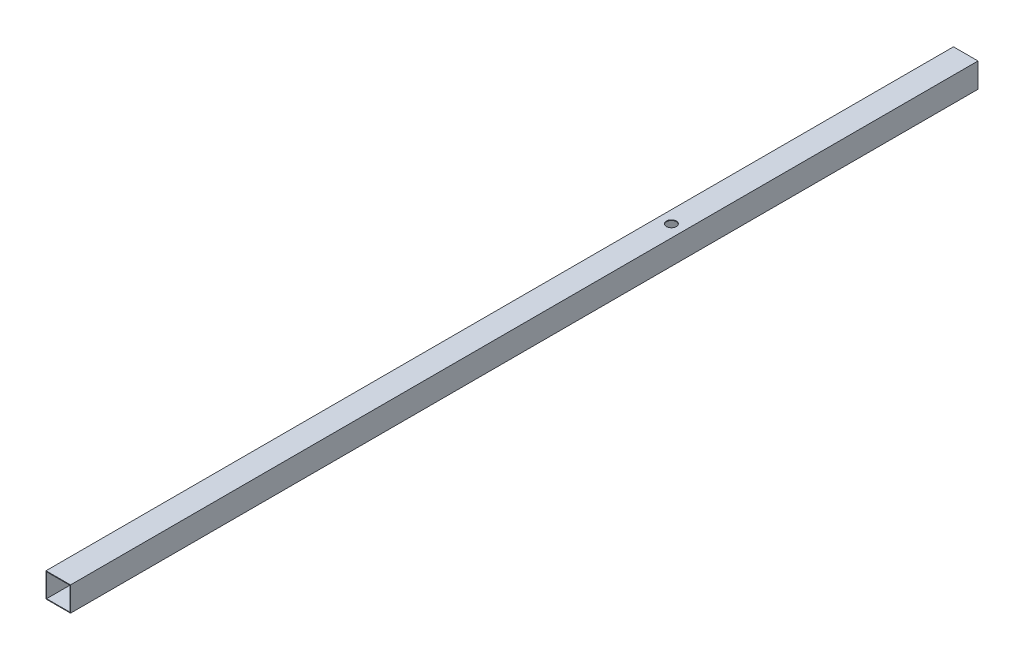
ISO-10303-21;
HEADER;
FILE_DESCRIPTION(('STEP AP214'),'2;1');
FILE_NAME('part.step','',(''),(''),'','','');
FILE_SCHEMA(('AUTOMOTIVE_DESIGN { 1 0 10303 214 1 1 1 1 }'));
ENDSEC;
DATA;
#1=APPLICATION_CONTEXT('core data for automotive mechanical design processes');
#2=APPLICATION_PROTOCOL_DEFINITION('international standard','automotive_design',2000,#1);
#3=PRODUCT_CONTEXT('',#1,'mechanical');
#4=PRODUCT('Part','Part','',(#3));
#5=PRODUCT_RELATED_PRODUCT_CATEGORY('part','',(#4));
#6=PRODUCT_DEFINITION_FORMATION('','',#4);
#7=PRODUCT_DEFINITION_CONTEXT('part definition',#1,'design');
#8=PRODUCT_DEFINITION('design','',#6,#7);
#9=PRODUCT_DEFINITION_SHAPE('','',#8);
#10=(LENGTH_UNIT() NAMED_UNIT(*) SI_UNIT(.MILLI.,.METRE.));
#11=(NAMED_UNIT(*) PLANE_ANGLE_UNIT() SI_UNIT($,.RADIAN.));
#12=(NAMED_UNIT(*) SI_UNIT($,.STERADIAN.) SOLID_ANGLE_UNIT());
#13=UNCERTAINTY_MEASURE_WITH_UNIT(LENGTH_MEASURE(1.E-05),#10,'distance_accuracy_value','');
#14=(GEOMETRIC_REPRESENTATION_CONTEXT(3) GLOBAL_UNCERTAINTY_ASSIGNED_CONTEXT((#13)) GLOBAL_UNIT_ASSIGNED_CONTEXT((#10,
#11,#12)) REPRESENTATION_CONTEXT('',''));
#15=CARTESIAN_POINT('',(0.,0.,0.));
#16=DIRECTION('',(0.,0.,1.));
#17=DIRECTION('',(1.,0.,0.));
#18=AXIS2_PLACEMENT_3D('',#15,#16,#17);
#19=CARTESIAN_POINT('',(10.,10.,740.));
#20=DIRECTION('',(-1.,0.,0.));
#21=DIRECTION('',(0.,-1.,0.));
#22=AXIS2_PLACEMENT_3D('',#19,#20,#21);
#23=PLANE('',#22);
#24=DIRECTION('',(0.,1.,0.));
#25=VECTOR('',#24,1.);
#26=CARTESIAN_POINT('',(10.,10.,0.));
#27=LINE('',#26,#25);
#28=CARTESIAN_POINT('',(10.,-10.,0.));
#29=VERTEX_POINT('',#28);
#30=CARTESIAN_POINT('',(10.,10.,0.));
#31=VERTEX_POINT('',#30);
#32=EDGE_CURVE('E134',#29,#31,#27,.T.);
#33=ORIENTED_EDGE('',*,*,#32,.T.);
#34=DIRECTION('',(0.,0.,-1.));
#35=VECTOR('',#34,1.);
#36=CARTESIAN_POINT('',(10.,10.,740.));
#37=LINE('',#36,#35);
#38=CARTESIAN_POINT('',(10.,10.,740.));
#39=VERTEX_POINT('',#38);
#40=EDGE_CURVE('E11',#39,#31,#37,.T.);
#41=ORIENTED_EDGE('',*,*,#40,.F.);
#42=DIRECTION('',(0.,1.,0.));
#43=VECTOR('',#42,1.);
#44=CARTESIAN_POINT('',(10.,10.,740.));
#45=LINE('',#44,#43);
#46=CARTESIAN_POINT('',(10.,-10.,740.));
#47=VERTEX_POINT('',#46);
#48=EDGE_CURVE('E138',#47,#39,#45,.T.);
#49=ORIENTED_EDGE('',*,*,#48,.F.);
#50=DIRECTION('',(0.,0.,-1.));
#51=VECTOR('',#50,1.);
#52=CARTESIAN_POINT('',(10.,-10.,740.));
#53=LINE('',#52,#51);
#54=EDGE_CURVE('E148',#47,#29,#53,.T.);
#55=ORIENTED_EDGE('',*,*,#54,.T.);
#56=EDGE_LOOP('',(#33,#41,#49,#55));
#57=FACE_BOUND('',#56,.T.);
#58=ADVANCED_FACE('F33',(#57),#23,.F.);
#59=CARTESIAN_POINT('',(-10.,10.,740.));
#60=DIRECTION('',(0.,-1.,0.));
#61=DIRECTION('',(0.,0.,-1.));
#62=AXIS2_PLACEMENT_3D('',#59,#60,#61);
#63=PLANE('',#62);
#64=CARTESIAN_POINT('',(0.,10.,240.));
#65=DIRECTION('',(0.,-1.,0.));
#66=DIRECTION('',(0.,0.,-1.));
#67=AXIS2_PLACEMENT_3D('',#64,#65,#66);
#68=CIRCLE('',#67,4.00000000000001);
#69=CARTESIAN_POINT('',(0.,10.,236.));
#70=VERTEX_POINT('',#69);
#71=EDGE_CURVE('E226',#70,#70,#68,.T.);
#72=ORIENTED_EDGE('',*,*,#71,.T.);
#73=EDGE_LOOP('',(#72));
#74=FACE_BOUND('',#73,.T.);
#75=DIRECTION('',(-1.,0.,0.));
#76=VECTOR('',#75,1.);
#77=CARTESIAN_POINT('',(-10.,10.,0.));
#78=LINE('',#77,#76);
#79=CARTESIAN_POINT('',(-10.,10.,0.));
#80=VERTEX_POINT('',#79);
#81=EDGE_CURVE('E151',#31,#80,#78,.T.);
#82=ORIENTED_EDGE('',*,*,#81,.T.);
#83=DIRECTION('',(0.,0.,-1.));
#84=VECTOR('',#83,1.);
#85=CARTESIAN_POINT('',(-10.,10.,740.));
#86=LINE('',#85,#84);
#87=CARTESIAN_POINT('',(-10.,10.,740.));
#88=VERTEX_POINT('',#87);
#89=EDGE_CURVE('E41',#88,#80,#86,.T.);
#90=ORIENTED_EDGE('',*,*,#89,.F.);
#91=DIRECTION('',(-1.,0.,0.));
#92=VECTOR('',#91,1.);
#93=CARTESIAN_POINT('',(-10.,10.,740.));
#94=LINE('',#93,#92);
#95=EDGE_CURVE('E141',#39,#88,#94,.T.);
#96=ORIENTED_EDGE('',*,*,#95,.F.);
#97=ORIENTED_EDGE('',*,*,#40,.T.);
#98=EDGE_LOOP('',(#82,#90,#96,#97));
#99=FACE_BOUND('',#98,.T.);
#100=ADVANCED_FACE('F180',(#74,#99),#63,.F.);
#101=CARTESIAN_POINT('',(-10.,10.,740.));
#102=DIRECTION('',(1.,0.,0.));
#103=DIRECTION('',(0.,1.,0.));
#104=AXIS2_PLACEMENT_3D('',#101,#102,#103);
#105=PLANE('',#104);
#106=DIRECTION('',(0.,-1.,0.));
#107=VECTOR('',#106,1.);
#108=CARTESIAN_POINT('',(-10.,10.,0.));
#109=LINE('',#108,#107);
#110=CARTESIAN_POINT('',(-10.,-10.,0.));
#111=VERTEX_POINT('',#110);
#112=EDGE_CURVE('E153',#80,#111,#109,.T.);
#113=ORIENTED_EDGE('',*,*,#112,.T.);
#114=DIRECTION('',(0.,0.,-1.));
#115=VECTOR('',#114,1.);
#116=CARTESIAN_POINT('',(-10.,-10.,740.));
#117=LINE('',#116,#115);
#118=CARTESIAN_POINT('',(-10.,-10.,740.));
#119=VERTEX_POINT('',#118);
#120=EDGE_CURVE('E158',#119,#111,#117,.T.);
#121=ORIENTED_EDGE('',*,*,#120,.F.);
#122=DIRECTION('',(0.,-1.,0.));
#123=VECTOR('',#122,1.);
#124=CARTESIAN_POINT('',(-10.,10.,740.));
#125=LINE('',#124,#123);
#126=EDGE_CURVE('E144',#88,#119,#125,.T.);
#127=ORIENTED_EDGE('',*,*,#126,.F.);
#128=ORIENTED_EDGE('',*,*,#89,.T.);
#129=EDGE_LOOP('',(#113,#121,#127,#128));
#130=FACE_BOUND('',#129,.T.);
#131=ADVANCED_FACE('F166',(#130),#105,.F.);
#132=CARTESIAN_POINT('',(-10.,-10.,740.));
#133=DIRECTION('',(0.,1.,0.));
#134=DIRECTION('',(0.,0.,1.));
#135=AXIS2_PLACEMENT_3D('',#132,#133,#134);
#136=PLANE('',#135);
#137=CARTESIAN_POINT('',(0.,-10.,240.));
#138=DIRECTION('',(0.,-1.,0.));
#139=DIRECTION('',(0.,0.,-1.));
#140=AXIS2_PLACEMENT_3D('',#137,#138,#139);
#141=CIRCLE('',#140,4.00000000000001);
#142=CARTESIAN_POINT('',(0.,-10.,236.));
#143=VERTEX_POINT('',#142);
#144=EDGE_CURVE('E222',#143,#143,#141,.T.);
#145=ORIENTED_EDGE('',*,*,#144,.F.);
#146=EDGE_LOOP('',(#145));
#147=FACE_BOUND('',#146,.T.);
#148=DIRECTION('',(1.,0.,0.));
#149=VECTOR('',#148,1.);
#150=CARTESIAN_POINT('',(-10.,-10.,0.));
#151=LINE('',#150,#149);
#152=EDGE_CURVE('E142',#111,#29,#151,.T.);
#153=ORIENTED_EDGE('',*,*,#152,.T.);
#154=ORIENTED_EDGE('',*,*,#54,.F.);
#155=DIRECTION('',(1.,0.,0.));
#156=VECTOR('',#155,1.);
#157=CARTESIAN_POINT('',(-10.,-10.,740.));
#158=LINE('',#157,#156);
#159=EDGE_CURVE('E146',#119,#47,#158,.T.);
#160=ORIENTED_EDGE('',*,*,#159,.F.);
#161=ORIENTED_EDGE('',*,*,#120,.T.);
#162=EDGE_LOOP('',(#153,#154,#160,#161));
#163=FACE_BOUND('',#162,.T.);
#164=ADVANCED_FACE('F175',(#147,#163),#136,.F.);
#165=CARTESIAN_POINT('',(0.,0.,740.));
#166=DIRECTION('',(0.,0.,1.));
#167=DIRECTION('',(1.,0.,0.));
#168=AXIS2_PLACEMENT_3D('',#165,#166,#167);
#169=PLANE('',#168);
#170=DIRECTION('',(0.,1.,0.));
#171=VECTOR('',#170,1.);
#172=CARTESIAN_POINT('',(-9.5,9.5,740.));
#173=LINE('',#172,#171);
#174=CARTESIAN_POINT('',(-9.5,-9.5,740.));
#175=VERTEX_POINT('',#174);
#176=CARTESIAN_POINT('',(-9.5,9.5,740.));
#177=VERTEX_POINT('',#176);
#178=EDGE_CURVE('E100',#175,#177,#173,.T.);
#179=ORIENTED_EDGE('',*,*,#178,.T.);
#180=DIRECTION('',(1.,0.,0.));
#181=VECTOR('',#180,1.);
#182=CARTESIAN_POINT('',(9.5,9.5,740.));
#183=LINE('',#182,#181);
#184=CARTESIAN_POINT('',(9.5,9.5,740.));
#185=VERTEX_POINT('',#184);
#186=EDGE_CURVE('E109',#177,#185,#183,.T.);
#187=ORIENTED_EDGE('',*,*,#186,.T.);
#188=DIRECTION('',(0.,-1.,0.));
#189=VECTOR('',#188,1.);
#190=CARTESIAN_POINT('',(9.5,9.5,740.));
#191=LINE('',#190,#189);
#192=CARTESIAN_POINT('',(9.5,-9.5,740.));
#193=VERTEX_POINT('',#192);
#194=EDGE_CURVE('E48',#185,#193,#191,.T.);
#195=ORIENTED_EDGE('',*,*,#194,.T.);
#196=DIRECTION('',(-1.,0.,0.));
#197=VECTOR('',#196,1.);
#198=CARTESIAN_POINT('',(9.5,-9.5,740.));
#199=LINE('',#198,#197);
#200=EDGE_CURVE('E106',#193,#175,#199,.T.);
#201=ORIENTED_EDGE('',*,*,#200,.T.);
#202=EDGE_LOOP('',(#179,#187,#195,#201));
#203=FACE_BOUND('',#202,.T.);
#204=ORIENTED_EDGE('',*,*,#48,.T.);
#205=ORIENTED_EDGE('',*,*,#95,.T.);
#206=ORIENTED_EDGE('',*,*,#126,.T.);
#207=ORIENTED_EDGE('',*,*,#159,.T.);
#208=EDGE_LOOP('',(#204,#205,#206,#207));
#209=FACE_BOUND('',#208,.T.);
#210=ADVANCED_FACE('F113',(#203,#209),#169,.T.);
#211=CARTESIAN_POINT('',(0.,0.,0.));
#212=DIRECTION('',(0.,0.,1.));
#213=DIRECTION('',(1.,0.,0.));
#214=AXIS2_PLACEMENT_3D('',#211,#212,#213);
#215=PLANE('',#214);
#216=DIRECTION('',(1.,0.,0.));
#217=VECTOR('',#216,1.);
#218=CARTESIAN_POINT('',(9.5,9.5,0.));
#219=LINE('',#218,#217);
#220=CARTESIAN_POINT('',(-9.5,9.5,0.));
#221=VERTEX_POINT('',#220);
#222=CARTESIAN_POINT('',(9.5,9.5,0.));
#223=VERTEX_POINT('',#222);
#224=EDGE_CURVE('E128',#221,#223,#219,.T.);
#225=ORIENTED_EDGE('',*,*,#224,.F.);
#226=DIRECTION('',(0.,1.,0.));
#227=VECTOR('',#226,1.);
#228=CARTESIAN_POINT('',(-9.5,9.5,0.));
#229=LINE('',#228,#227);
#230=CARTESIAN_POINT('',(-9.5,-9.5,0.));
#231=VERTEX_POINT('',#230);
#232=EDGE_CURVE('E56',#231,#221,#229,.T.);
#233=ORIENTED_EDGE('',*,*,#232,.F.);
#234=DIRECTION('',(-1.,0.,0.));
#235=VECTOR('',#234,1.);
#236=CARTESIAN_POINT('',(9.5,-9.5,0.));
#237=LINE('',#236,#235);
#238=CARTESIAN_POINT('',(9.5,-9.5,0.));
#239=VERTEX_POINT('',#238);
#240=EDGE_CURVE('E116',#239,#231,#237,.T.);
#241=ORIENTED_EDGE('',*,*,#240,.F.);
#242=DIRECTION('',(0.,-1.,0.));
#243=VECTOR('',#242,1.);
#244=CARTESIAN_POINT('',(9.5,9.5,0.));
#245=LINE('',#244,#243);
#246=EDGE_CURVE('E119',#223,#239,#245,.T.);
#247=ORIENTED_EDGE('',*,*,#246,.F.);
#248=EDGE_LOOP('',(#225,#233,#241,#247));
#249=FACE_BOUND('',#248,.T.);
#250=ORIENTED_EDGE('',*,*,#32,.F.);
#251=ORIENTED_EDGE('',*,*,#152,.F.);
#252=ORIENTED_EDGE('',*,*,#112,.F.);
#253=ORIENTED_EDGE('',*,*,#81,.F.);
#254=EDGE_LOOP('',(#250,#251,#252,#253));
#255=FACE_BOUND('',#254,.T.);
#256=ADVANCED_FACE('F172',(#249,#255),#215,.F.);
#257=CARTESIAN_POINT('',(-9.5,9.5,740.));
#258=DIRECTION('',(-1.,0.,0.));
#259=DIRECTION('',(0.,-1.,0.));
#260=AXIS2_PLACEMENT_3D('',#257,#258,#259);
#261=PLANE('',#260);
#262=ORIENTED_EDGE('',*,*,#232,.T.);
#263=DIRECTION('',(0.,0.,-1.));
#264=VECTOR('',#263,1.);
#265=CARTESIAN_POINT('',(-9.5,9.5,740.));
#266=LINE('',#265,#264);
#267=EDGE_CURVE('E96',#177,#221,#266,.T.);
#268=ORIENTED_EDGE('',*,*,#267,.F.);
#269=ORIENTED_EDGE('',*,*,#178,.F.);
#270=DIRECTION('',(0.,0.,-1.));
#271=VECTOR('',#270,1.);
#272=CARTESIAN_POINT('',(-9.5,-9.5,740.));
#273=LINE('',#272,#271);
#274=EDGE_CURVE('E132',#175,#231,#273,.T.);
#275=ORIENTED_EDGE('',*,*,#274,.T.);
#276=EDGE_LOOP('',(#262,#268,#269,#275));
#277=FACE_BOUND('',#276,.T.);
#278=ADVANCED_FACE('F98',(#277),#261,.F.);
#279=CARTESIAN_POINT('',(9.5,-9.5,740.));
#280=DIRECTION('',(0.,-1.,0.));
#281=DIRECTION('',(0.,0.,-1.));
#282=AXIS2_PLACEMENT_3D('',#279,#280,#281);
#283=PLANE('',#282);
#284=CARTESIAN_POINT('',(0.,-9.50000000000001,240.));
#285=DIRECTION('',(0.,-1.,0.));
#286=DIRECTION('',(0.,0.,-1.));
#287=AXIS2_PLACEMENT_3D('',#284,#285,#286);
#288=CIRCLE('',#287,4.00000000000001);
#289=CARTESIAN_POINT('',(0.,-9.50000000000001,236.));
#290=VERTEX_POINT('',#289);
#291=EDGE_CURVE('E122',#290,#290,#288,.T.);
#292=ORIENTED_EDGE('',*,*,#291,.T.);
#293=EDGE_LOOP('',(#292));
#294=FACE_BOUND('',#293,.T.);
#295=ORIENTED_EDGE('',*,*,#240,.T.);
#296=ORIENTED_EDGE('',*,*,#274,.F.);
#297=ORIENTED_EDGE('',*,*,#200,.F.);
#298=DIRECTION('',(0.,0.,-1.));
#299=VECTOR('',#298,1.);
#300=CARTESIAN_POINT('',(9.5,-9.5,740.));
#301=LINE('',#300,#299);
#302=EDGE_CURVE('E135',#193,#239,#301,.T.);
#303=ORIENTED_EDGE('',*,*,#302,.T.);
#304=EDGE_LOOP('',(#295,#296,#297,#303));
#305=FACE_BOUND('',#304,.T.);
#306=ADVANCED_FACE('F201',(#294,#305),#283,.F.);
#307=CARTESIAN_POINT('',(9.5,9.5,740.));
#308=DIRECTION('',(1.,0.,0.));
#309=DIRECTION('',(0.,1.,0.));
#310=AXIS2_PLACEMENT_3D('',#307,#308,#309);
#311=PLANE('',#310);
#312=ORIENTED_EDGE('',*,*,#246,.T.);
#313=ORIENTED_EDGE('',*,*,#302,.F.);
#314=ORIENTED_EDGE('',*,*,#194,.F.);
#315=DIRECTION('',(0.,0.,-1.));
#316=VECTOR('',#315,1.);
#317=CARTESIAN_POINT('',(9.5,9.5,740.));
#318=LINE('',#317,#316);
#319=EDGE_CURVE('E105',#185,#223,#318,.T.);
#320=ORIENTED_EDGE('',*,*,#319,.T.);
#321=EDGE_LOOP('',(#312,#313,#314,#320));
#322=FACE_BOUND('',#321,.T.);
#323=ADVANCED_FACE('F205',(#322),#311,.F.);
#324=CARTESIAN_POINT('',(9.5,9.5,740.));
#325=DIRECTION('',(0.,1.,0.));
#326=DIRECTION('',(0.,0.,1.));
#327=AXIS2_PLACEMENT_3D('',#324,#325,#326);
#328=PLANE('',#327);
#329=CARTESIAN_POINT('',(0.,9.5,240.));
#330=DIRECTION('',(0.,1.,0.));
#331=DIRECTION('',(0.,0.,1.));
#332=AXIS2_PLACEMENT_3D('',#329,#330,#331);
#333=CIRCLE('',#332,4.00000000000001);
#334=CARTESIAN_POINT('',(0.,9.5,244.));
#335=VERTEX_POINT('',#334);
#336=EDGE_CURVE('E36',#335,#335,#333,.T.);
#337=ORIENTED_EDGE('',*,*,#336,.T.);
#338=EDGE_LOOP('',(#337));
#339=FACE_BOUND('',#338,.T.);
#340=ORIENTED_EDGE('',*,*,#224,.T.);
#341=ORIENTED_EDGE('',*,*,#319,.F.);
#342=ORIENTED_EDGE('',*,*,#186,.F.);
#343=ORIENTED_EDGE('',*,*,#267,.T.);
#344=EDGE_LOOP('',(#340,#341,#342,#343));
#345=FACE_BOUND('',#344,.T.);
#346=ADVANCED_FACE('F110',(#339,#345),#328,.F.);
#347=CARTESIAN_POINT('',(0.,10.,240.));
#348=DIRECTION('',(0.,-1.,0.));
#349=DIRECTION('',(0.,0.,-1.));
#350=AXIS2_PLACEMENT_3D('',#347,#348,#349);
#351=CYLINDRICAL_SURFACE('',#350,4.00000000000001);
#352=ORIENTED_EDGE('',*,*,#71,.F.);
#353=EDGE_LOOP('',(#352));
#354=FACE_BOUND('',#353,.T.);
#355=ORIENTED_EDGE('',*,*,#336,.F.);
#356=EDGE_LOOP('',(#355));
#357=FACE_BOUND('',#356,.T.);
#358=ADVANCED_FACE('F204',(#354,#357),#351,.F.);
#359=ORIENTED_EDGE('',*,*,#144,.T.);
#360=EDGE_LOOP('',(#359));
#361=FACE_BOUND('',#360,.T.);
#362=ORIENTED_EDGE('',*,*,#291,.F.);
#363=EDGE_LOOP('',(#362));
#364=FACE_BOUND('',#363,.T.);
#365=ADVANCED_FACE('F212',(#361,#364),#351,.F.);
#366=CLOSED_SHELL('',(#58,#100,#131,#164,#210,#256,#278,#306,#323,#346,#358,#365));
#367=MANIFOLD_SOLID_BREP('B2',#366);
#368=ADVANCED_BREP_SHAPE_REPRESENTATION('',(#18,#367),#14);
#369=SHAPE_DEFINITION_REPRESENTATION(#9,#368);
ENDSEC;
END-ISO-10303-21;
